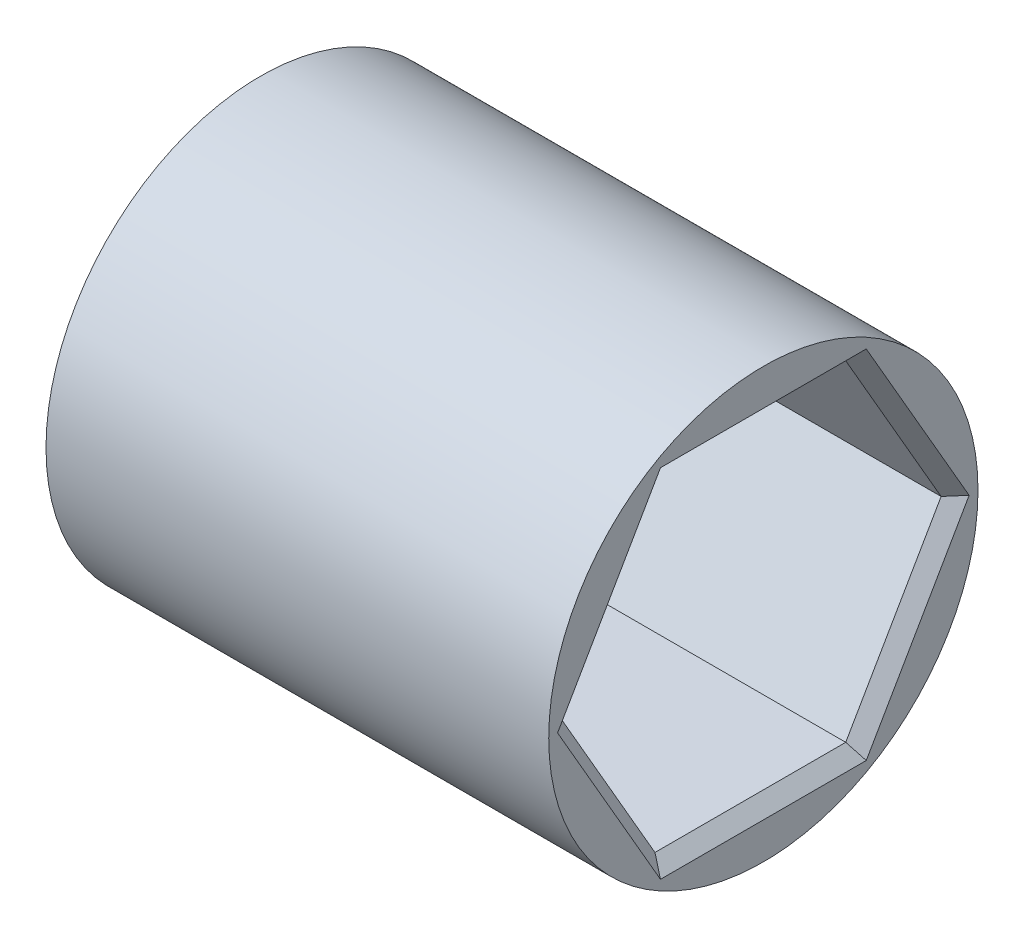
ISO-10303-21;
HEADER;
FILE_DESCRIPTION(('STEP AP214'),'2;1');
FILE_NAME('part.step','',(''),(''),'','','');
FILE_SCHEMA(('AUTOMOTIVE_DESIGN { 1 0 10303 214 1 1 1 1 }'));
ENDSEC;
DATA;
#1=APPLICATION_CONTEXT('core data for automotive mechanical design processes');
#2=APPLICATION_PROTOCOL_DEFINITION('international standard','automotive_design',2000,#1);
#3=PRODUCT_CONTEXT('',#1,'mechanical');
#4=PRODUCT('Part','Part','',(#3));
#5=PRODUCT_RELATED_PRODUCT_CATEGORY('part','',(#4));
#6=PRODUCT_DEFINITION_FORMATION('','',#4);
#7=PRODUCT_DEFINITION_CONTEXT('part definition',#1,'design');
#8=PRODUCT_DEFINITION('design','',#6,#7);
#9=PRODUCT_DEFINITION_SHAPE('','',#8);
#10=(LENGTH_UNIT() NAMED_UNIT(*) SI_UNIT(.MILLI.,.METRE.));
#11=(NAMED_UNIT(*) PLANE_ANGLE_UNIT() SI_UNIT($,.RADIAN.));
#12=(NAMED_UNIT(*) SI_UNIT($,.STERADIAN.) SOLID_ANGLE_UNIT());
#13=UNCERTAINTY_MEASURE_WITH_UNIT(LENGTH_MEASURE(1.E-05),#10,'distance_accuracy_value','');
#14=(GEOMETRIC_REPRESENTATION_CONTEXT(3) GLOBAL_UNCERTAINTY_ASSIGNED_CONTEXT((#13)) GLOBAL_UNIT_ASSIGNED_CONTEXT((#10,
#11,#12)) REPRESENTATION_CONTEXT('',''));
#15=CARTESIAN_POINT('',(0.,0.,0.));
#16=DIRECTION('',(0.,0.,1.));
#17=DIRECTION('',(1.,0.,0.));
#18=AXIS2_PLACEMENT_3D('',#15,#16,#17);
#19=CARTESIAN_POINT('',(-20.17981642,0.,0.));
#20=DIRECTION('',(-1.,0.,0.));
#21=DIRECTION('',(0.,0.,1.));
#22=AXIS2_PLACEMENT_3D('',#19,#20,#21);
#23=CYLINDRICAL_SURFACE('',#22,8.25);
#24=CARTESIAN_POINT('',(0.,0.,0.));
#25=DIRECTION('',(-1.,0.,0.));
#26=DIRECTION('',(0.,0.,1.));
#27=AXIS2_PLACEMENT_3D('',#24,#25,#26);
#28=CIRCLE('',#27,8.25);
#29=CARTESIAN_POINT('',(0.,0.,8.25));
#30=VERTEX_POINT('',#29);
#31=EDGE_CURVE('E182',#30,#30,#28,.T.);
#32=ORIENTED_EDGE('',*,*,#31,.T.);
#33=EDGE_LOOP('',(#32));
#34=FACE_BOUND('',#33,.T.);
#35=CARTESIAN_POINT('',(-19.3231192,0.,0.));
#36=DIRECTION('',(-1.,0.,0.));
#37=DIRECTION('',(0.,0.,1.));
#38=AXIS2_PLACEMENT_3D('',#35,#36,#37);
#39=CIRCLE('',#38,8.25);
#40=CARTESIAN_POINT('',(-19.3231192,0.,8.25));
#41=VERTEX_POINT('',#40);
#42=EDGE_CURVE('E189',#41,#41,#39,.T.);
#43=ORIENTED_EDGE('',*,*,#42,.F.);
#44=EDGE_LOOP('',(#43));
#45=FACE_BOUND('',#44,.T.);
#46=ADVANCED_FACE('F51',(#34,#45),#23,.T.);
#47=CARTESIAN_POINT('',(-19.3231192,0.,0.));
#48=DIRECTION('',(-1.,0.,0.));
#49=DIRECTION('',(0.,0.,1.));
#50=AXIS2_PLACEMENT_3D('',#47,#48,#49);
#51=PLANE('',#50);
#52=DIRECTION('',(0.,0.,-1.));
#53=VECTOR('',#52,1.);
#54=CARTESIAN_POINT('',(-19.3231192,-6.85,-3.66617420935412));
#55=LINE('',#54,#53);
#56=CARTESIAN_POINT('',(-19.3231192,-6.85,3.95484934394893));
#57=VERTEX_POINT('',#56);
#58=CARTESIAN_POINT('',(-19.3231192,-6.85,-3.95484934394894));
#59=VERTEX_POINT('',#58);
#60=EDGE_CURVE('E218',#57,#59,#55,.T.);
#61=ORIENTED_EDGE('',*,*,#60,.T.);
#62=DIRECTION('',(0.,0.866025403784439,-0.5));
#63=VECTOR('',#62,1.);
#64=CARTESIAN_POINT('',(-19.3231192,-0.25,-7.76536112060047));
#65=LINE('',#64,#63);
#66=CARTESIAN_POINT('',(-19.3231192,0.,-7.90969868789787));
#67=VERTEX_POINT('',#66);
#68=EDGE_CURVE('E150',#59,#67,#65,.T.);
#69=ORIENTED_EDGE('',*,*,#68,.T.);
#70=DIRECTION('',(0.,0.866025403784439,0.5));
#71=VECTOR('',#70,1.);
#72=CARTESIAN_POINT('',(-19.3231192,6.6,-4.09918691124634));
#73=LINE('',#72,#71);
#74=CARTESIAN_POINT('',(-19.3231192,6.85,-3.95484934394893));
#75=VERTEX_POINT('',#74);
#76=EDGE_CURVE('E176',#67,#75,#73,.T.);
#77=ORIENTED_EDGE('',*,*,#76,.T.);
#78=DIRECTION('',(0.,0.,1.));
#79=VECTOR('',#78,1.);
#80=CARTESIAN_POINT('',(-19.3231192,6.85,3.66617420935412));
#81=LINE('',#80,#79);
#82=CARTESIAN_POINT('',(-19.3231192,6.85,3.95484934394894));
#83=VERTEX_POINT('',#82);
#84=EDGE_CURVE('E212',#75,#83,#81,.T.);
#85=ORIENTED_EDGE('',*,*,#84,.T.);
#86=DIRECTION('',(0.,-0.866025403784439,0.5));
#87=VECTOR('',#86,1.);
#88=CARTESIAN_POINT('',(-19.3231192,0.25,7.76536112060047));
#89=LINE('',#88,#87);
#90=CARTESIAN_POINT('',(-19.3231192,0.,7.90969868789787));
#91=VERTEX_POINT('',#90);
#92=EDGE_CURVE('E214',#83,#91,#89,.T.);
#93=ORIENTED_EDGE('',*,*,#92,.T.);
#94=DIRECTION('',(0.,-0.866025403784439,-0.5));
#95=VECTOR('',#94,1.);
#96=CARTESIAN_POINT('',(-19.3231192,-6.6,4.09918691124634));
#97=LINE('',#96,#95);
#98=EDGE_CURVE('E216',#91,#57,#97,.T.);
#99=ORIENTED_EDGE('',*,*,#98,.T.);
#100=EDGE_LOOP('',(#61,#69,#77,#85,#93,#99));
#101=FACE_BOUND('',#100,.T.);
#102=ORIENTED_EDGE('',*,*,#42,.T.);
#103=EDGE_LOOP('',(#102));
#104=FACE_BOUND('',#103,.T.);
#105=ADVANCED_FACE('F305',(#101,#104),#51,.T.);
#106=CARTESIAN_POINT('',(0.,0.,0.));
#107=DIRECTION('',(-1.,0.,0.));
#108=DIRECTION('',(0.,0.,1.));
#109=AXIS2_PLACEMENT_3D('',#106,#107,#108);
#110=PLANE('',#109);
#111=DIRECTION('',(0.,0.,-1.));
#112=VECTOR('',#111,1.);
#113=CARTESIAN_POINT('',(0.,6.85,0.));
#114=LINE('',#113,#112);
#115=CARTESIAN_POINT('',(0.,6.85,3.95484934394894));
#116=VERTEX_POINT('',#115);
#117=CARTESIAN_POINT('',(0.,6.85,-3.95484934394893));
#118=VERTEX_POINT('',#117);
#119=EDGE_CURVE('E238',#116,#118,#114,.T.);
#120=ORIENTED_EDGE('',*,*,#119,.T.);
#121=DIRECTION('',(0.,-0.866025403784439,-0.5));
#122=VECTOR('',#121,1.);
#123=CARTESIAN_POINT('',(0.,3.425,-5.9322740159234));
#124=LINE('',#123,#122);
#125=CARTESIAN_POINT('',(0.,0.,-7.90969868789787));
#126=VERTEX_POINT('',#125);
#127=EDGE_CURVE('E11',#118,#126,#124,.T.);
#128=ORIENTED_EDGE('',*,*,#127,.T.);
#129=DIRECTION('',(0.,-0.866025403784439,0.5));
#130=VECTOR('',#129,1.);
#131=CARTESIAN_POINT('',(0.,-3.425,-5.93227401592341));
#132=LINE('',#131,#130);
#133=CARTESIAN_POINT('',(0.,-6.85,-3.95484934394894));
#134=VERTEX_POINT('',#133);
#135=EDGE_CURVE('E61',#126,#134,#132,.T.);
#136=ORIENTED_EDGE('',*,*,#135,.T.);
#137=DIRECTION('',(0.,0.,1.));
#138=VECTOR('',#137,1.);
#139=CARTESIAN_POINT('',(0.,-6.85,0.));
#140=LINE('',#139,#138);
#141=CARTESIAN_POINT('',(0.,-6.85,3.95484934394893));
#142=VERTEX_POINT('',#141);
#143=EDGE_CURVE('E244',#134,#142,#140,.T.);
#144=ORIENTED_EDGE('',*,*,#143,.T.);
#145=DIRECTION('',(0.,0.866025403784439,0.5));
#146=VECTOR('',#145,1.);
#147=CARTESIAN_POINT('',(0.,-3.425,5.9322740159234));
#148=LINE('',#147,#146);
#149=CARTESIAN_POINT('',(0.,0.,7.90969868789787));
#150=VERTEX_POINT('',#149);
#151=EDGE_CURVE('E242',#142,#150,#148,.T.);
#152=ORIENTED_EDGE('',*,*,#151,.T.);
#153=DIRECTION('',(0.,0.866025403784439,-0.5));
#154=VECTOR('',#153,1.);
#155=CARTESIAN_POINT('',(0.,3.425,5.93227401592341));
#156=LINE('',#155,#154);
#157=EDGE_CURVE('E240',#150,#116,#156,.T.);
#158=ORIENTED_EDGE('',*,*,#157,.T.);
#159=EDGE_LOOP('',(#120,#128,#136,#144,#152,#158));
#160=FACE_BOUND('',#159,.T.);
#161=ORIENTED_EDGE('',*,*,#31,.F.);
#162=EDGE_LOOP('',(#161));
#163=FACE_BOUND('',#162,.T.);
#164=ADVANCED_FACE('F278',(#160,#163),#110,.F.);
#165=CARTESIAN_POINT('',(-20.17981642,-6.35,-3.66617420935412));
#166=DIRECTION('',(0.,-0.5,-0.866025403784439));
#167=DIRECTION('',(0.,0.866025403784439,-0.5));
#168=AXIS2_PLACEMENT_3D('',#165,#166,#167);
#169=PLANE('',#168);
#170=DIRECTION('',(1.,0.,0.));
#171=VECTOR('',#170,1.);
#172=CARTESIAN_POINT('',(-20.17981642,0.,-7.33234841870825));
#173=LINE('',#172,#171);
#174=CARTESIAN_POINT('',(-18.8231192,0.,-7.33234841870825));
#175=VERTEX_POINT('',#174);
#176=CARTESIAN_POINT('',(-0.5,0.,-7.33234841870825));
#177=VERTEX_POINT('',#176);
#178=EDGE_CURVE('E174',#175,#177,#173,.T.);
#179=ORIENTED_EDGE('',*,*,#178,.F.);
#180=DIRECTION('',(0.,-0.866025403784439,0.5));
#181=VECTOR('',#180,1.);
#182=CARTESIAN_POINT('',(-18.8231192,-6.35,-3.66617420935412));
#183=LINE('',#182,#181);
#184=CARTESIAN_POINT('',(-18.8231192,-6.35,-3.66617420935412));
#185=VERTEX_POINT('',#184);
#186=EDGE_CURVE('E148',#175,#185,#183,.T.);
#187=ORIENTED_EDGE('',*,*,#186,.T.);
#188=DIRECTION('',(1.,0.,0.));
#189=VECTOR('',#188,1.);
#190=CARTESIAN_POINT('',(-20.17981642,-6.35,-3.66617420935412));
#191=LINE('',#190,#189);
#192=CARTESIAN_POINT('',(-0.5,-6.35,-3.66617420935412));
#193=VERTEX_POINT('',#192);
#194=EDGE_CURVE('E171',#185,#193,#191,.T.);
#195=ORIENTED_EDGE('',*,*,#194,.T.);
#196=DIRECTION('',(0.,0.866025403784439,-0.5));
#197=VECTOR('',#196,1.);
#198=CARTESIAN_POINT('',(-0.5,-6.35,-3.66617420935412));
#199=LINE('',#198,#197);
#200=EDGE_CURVE('E177',#193,#177,#199,.T.);
#201=ORIENTED_EDGE('',*,*,#200,.T.);
#202=EDGE_LOOP('',(#179,#187,#195,#201));
#203=FACE_BOUND('',#202,.T.);
#204=ADVANCED_FACE('F170',(#203),#169,.F.);
#205=CARTESIAN_POINT('',(-20.17981642,-6.35,3.66617420935412));
#206=DIRECTION('',(0.,-1.,0.));
#207=DIRECTION('',(0.,0.,-1.));
#208=AXIS2_PLACEMENT_3D('',#205,#206,#207);
#209=PLANE('',#208);
#210=ORIENTED_EDGE('',*,*,#194,.F.);
#211=DIRECTION('',(0.,0.,1.));
#212=VECTOR('',#211,1.);
#213=CARTESIAN_POINT('',(-18.8231192,-6.35,3.66617420935412));
#214=LINE('',#213,#212);
#215=CARTESIAN_POINT('',(-18.8231192,-6.35,3.66617420935412));
#216=VERTEX_POINT('',#215);
#217=EDGE_CURVE('E156',#185,#216,#214,.T.);
#218=ORIENTED_EDGE('',*,*,#217,.T.);
#219=DIRECTION('',(1.,0.,0.));
#220=VECTOR('',#219,1.);
#221=CARTESIAN_POINT('',(-20.17981642,-6.35,3.66617420935412));
#222=LINE('',#221,#220);
#223=CARTESIAN_POINT('',(-0.5,-6.35,3.66617420935412));
#224=VERTEX_POINT('',#223);
#225=EDGE_CURVE('E183',#216,#224,#222,.T.);
#226=ORIENTED_EDGE('',*,*,#225,.T.);
#227=DIRECTION('',(0.,0.,-1.));
#228=VECTOR('',#227,1.);
#229=CARTESIAN_POINT('',(-0.5,-6.35,3.66617420935412));
#230=LINE('',#229,#228);
#231=EDGE_CURVE('E165',#224,#193,#230,.T.);
#232=ORIENTED_EDGE('',*,*,#231,.T.);
#233=EDGE_LOOP('',(#210,#218,#226,#232));
#234=FACE_BOUND('',#233,.T.);
#235=ADVANCED_FACE('F179',(#234),#209,.F.);
#236=CARTESIAN_POINT('',(-20.17981642,0.,7.33234841870825));
#237=DIRECTION('',(0.,-0.5,0.866025403784439));
#238=DIRECTION('',(0.,-0.866025403784439,-0.5));
#239=AXIS2_PLACEMENT_3D('',#236,#237,#238);
#240=PLANE('',#239);
#241=ORIENTED_EDGE('',*,*,#225,.F.);
#242=DIRECTION('',(0.,0.866025403784439,0.5));
#243=VECTOR('',#242,1.);
#244=CARTESIAN_POINT('',(-18.8231192,0.,7.33234841870825));
#245=LINE('',#244,#243);
#246=CARTESIAN_POINT('',(-18.8231192,0.,7.33234841870825));
#247=VERTEX_POINT('',#246);
#248=EDGE_CURVE('E223',#216,#247,#245,.T.);
#249=ORIENTED_EDGE('',*,*,#248,.T.);
#250=DIRECTION('',(1.,0.,0.));
#251=VECTOR('',#250,1.);
#252=CARTESIAN_POINT('',(-20.17981642,0.,7.33234841870825));
#253=LINE('',#252,#251);
#254=CARTESIAN_POINT('',(-0.5,0.,7.33234841870825));
#255=VERTEX_POINT('',#254);
#256=EDGE_CURVE('E192',#247,#255,#253,.T.);
#257=ORIENTED_EDGE('',*,*,#256,.T.);
#258=DIRECTION('',(0.,-0.866025403784439,-0.5));
#259=VECTOR('',#258,1.);
#260=CARTESIAN_POINT('',(-0.5,0.,7.33234841870825));
#261=LINE('',#260,#259);
#262=EDGE_CURVE('E164',#255,#224,#261,.T.);
#263=ORIENTED_EDGE('',*,*,#262,.T.);
#264=EDGE_LOOP('',(#241,#249,#257,#263));
#265=FACE_BOUND('',#264,.T.);
#266=ADVANCED_FACE('F315',(#265),#240,.F.);
#267=CARTESIAN_POINT('',(-20.17981642,6.35,3.66617420935412));
#268=DIRECTION('',(0.,0.5,0.866025403784439));
#269=DIRECTION('',(0.,-0.866025403784438,0.5));
#270=AXIS2_PLACEMENT_3D('',#267,#268,#269);
#271=PLANE('',#270);
#272=ORIENTED_EDGE('',*,*,#256,.F.);
#273=DIRECTION('',(0.,0.866025403784438,-0.5));
#274=VECTOR('',#273,1.);
#275=CARTESIAN_POINT('',(-18.8231192,6.35,3.66617420935412));
#276=LINE('',#275,#274);
#277=CARTESIAN_POINT('',(-18.8231192,6.35,3.66617420935412));
#278=VERTEX_POINT('',#277);
#279=EDGE_CURVE('E227',#247,#278,#276,.T.);
#280=ORIENTED_EDGE('',*,*,#279,.T.);
#281=DIRECTION('',(1.,0.,0.));
#282=VECTOR('',#281,1.);
#283=CARTESIAN_POINT('',(-20.17981642,6.35,3.66617420935412));
#284=LINE('',#283,#282);
#285=CARTESIAN_POINT('',(-0.5,6.35,3.66617420935412));
#286=VERTEX_POINT('',#285);
#287=EDGE_CURVE('E198',#278,#286,#284,.T.);
#288=ORIENTED_EDGE('',*,*,#287,.T.);
#289=DIRECTION('',(0.,-0.866025403784438,0.5));
#290=VECTOR('',#289,1.);
#291=CARTESIAN_POINT('',(-0.5,6.35,3.66617420935412));
#292=LINE('',#291,#290);
#293=EDGE_CURVE('E225',#286,#255,#292,.T.);
#294=ORIENTED_EDGE('',*,*,#293,.T.);
#295=EDGE_LOOP('',(#272,#280,#288,#294));
#296=FACE_BOUND('',#295,.T.);
#297=ADVANCED_FACE('F318',(#296),#271,.F.);
#298=CARTESIAN_POINT('',(-20.17981642,6.35,-3.66617420935412));
#299=DIRECTION('',(0.,1.,0.));
#300=DIRECTION('',(0.,0.,1.));
#301=AXIS2_PLACEMENT_3D('',#298,#299,#300);
#302=PLANE('',#301);
#303=ORIENTED_EDGE('',*,*,#287,.F.);
#304=DIRECTION('',(0.,0.,-1.));
#305=VECTOR('',#304,1.);
#306=CARTESIAN_POINT('',(-18.8231192,6.35,-3.66617420935412));
#307=LINE('',#306,#305);
#308=CARTESIAN_POINT('',(-18.8231192,6.35,-3.66617420935412));
#309=VERTEX_POINT('',#308);
#310=EDGE_CURVE('E231',#278,#309,#307,.T.);
#311=ORIENTED_EDGE('',*,*,#310,.T.);
#312=DIRECTION('',(1.,0.,0.));
#313=VECTOR('',#312,1.);
#314=CARTESIAN_POINT('',(-20.17981642,6.35,-3.66617420935412));
#315=LINE('',#314,#313);
#316=CARTESIAN_POINT('',(-0.5,6.35,-3.66617420935412));
#317=VERTEX_POINT('',#316);
#318=EDGE_CURVE('E202',#309,#317,#315,.T.);
#319=ORIENTED_EDGE('',*,*,#318,.T.);
#320=DIRECTION('',(0.,0.,1.));
#321=VECTOR('',#320,1.);
#322=CARTESIAN_POINT('',(-0.5,6.35,-3.66617420935412));
#323=LINE('',#322,#321);
#324=EDGE_CURVE('E229',#317,#286,#323,.T.);
#325=ORIENTED_EDGE('',*,*,#324,.T.);
#326=EDGE_LOOP('',(#303,#311,#319,#325));
#327=FACE_BOUND('',#326,.T.);
#328=ADVANCED_FACE('F294',(#327),#302,.F.);
#329=CARTESIAN_POINT('',(-20.17981642,0.,-7.33234841870825));
#330=DIRECTION('',(0.,0.5,-0.866025403784439));
#331=DIRECTION('',(0.,0.866025403784439,0.5));
#332=AXIS2_PLACEMENT_3D('',#329,#330,#331);
#333=PLANE('',#332);
#334=ORIENTED_EDGE('',*,*,#318,.F.);
#335=DIRECTION('',(0.,-0.866025403784439,-0.5));
#336=VECTOR('',#335,1.);
#337=CARTESIAN_POINT('',(-18.8231192,0.,-7.33234841870825));
#338=LINE('',#337,#336);
#339=EDGE_CURVE('E236',#309,#175,#338,.T.);
#340=ORIENTED_EDGE('',*,*,#339,.T.);
#341=ORIENTED_EDGE('',*,*,#178,.T.);
#342=DIRECTION('',(0.,0.866025403784439,0.5));
#343=VECTOR('',#342,1.);
#344=CARTESIAN_POINT('',(-0.5,0.,-7.33234841870825));
#345=LINE('',#344,#343);
#346=EDGE_CURVE('E233',#177,#317,#345,.T.);
#347=ORIENTED_EDGE('',*,*,#346,.T.);
#348=EDGE_LOOP('',(#334,#340,#341,#347));
#349=FACE_BOUND('',#348,.T.);
#350=ADVANCED_FACE('F290',(#349),#333,.F.);
#351=CARTESIAN_POINT('',(-18.8231192,6.35,3.66617420935412));
#352=DIRECTION('',(-0.707106781186551,-0.353553390593272,-0.612372435695791));
#353=DIRECTION('',(0.,-0.866025403784438,0.5));
#354=AXIS2_PLACEMENT_3D('',#351,#352,#353);
#355=PLANE('',#354);
#356=DIRECTION('',(-0.654653670707973,0.,0.755928946018458));
#357=VECTOR('',#356,1.);
#358=CARTESIAN_POINT('',(-18.8231192,0.,7.33234841870825));
#359=LINE('',#358,#357);
#360=EDGE_CURVE('E252',#91,#247,#359,.F.);
#361=ORIENTED_EDGE('',*,*,#360,.F.);
#362=ORIENTED_EDGE('',*,*,#92,.F.);
#363=DIRECTION('',(-0.654653670707973,0.65465367070798,0.377964473009229));
#364=VECTOR('',#363,1.);
#365=CARTESIAN_POINT('',(-18.8231192,6.35,3.66617420935412));
#366=LINE('',#365,#364);
#367=EDGE_CURVE('E206',#278,#83,#366,.T.);
#368=ORIENTED_EDGE('',*,*,#367,.F.);
#369=ORIENTED_EDGE('',*,*,#279,.F.);
#370=EDGE_LOOP('',(#361,#362,#368,#369));
#371=FACE_BOUND('',#370,.T.);
#372=ADVANCED_FACE('F320',(#371),#355,.T.);
#373=CARTESIAN_POINT('',(-18.8231192,6.35,-3.66617420935412));
#374=DIRECTION('',(-0.707106781186551,-0.707106781186544,0.));
#375=DIRECTION('',(0.,0.,1.));
#376=AXIS2_PLACEMENT_3D('',#373,#374,#375);
#377=PLANE('',#376);
#378=ORIENTED_EDGE('',*,*,#367,.T.);
#379=ORIENTED_EDGE('',*,*,#84,.F.);
#380=DIRECTION('',(-0.654653670707974,0.65465367070798,-0.377964473009228));
#381=VECTOR('',#380,1.);
#382=CARTESIAN_POINT('',(-18.8231192,6.35,-3.66617420935412));
#383=LINE('',#382,#381);
#384=EDGE_CURVE('E249',#309,#75,#383,.T.);
#385=ORIENTED_EDGE('',*,*,#384,.F.);
#386=ORIENTED_EDGE('',*,*,#310,.F.);
#387=EDGE_LOOP('',(#378,#379,#385,#386));
#388=FACE_BOUND('',#387,.T.);
#389=ADVANCED_FACE('F298',(#388),#377,.T.);
#390=CARTESIAN_POINT('',(-18.8231192,0.,7.33234841870825));
#391=DIRECTION('',(-0.707106781186551,0.353553390593272,-0.612372435695791));
#392=DIRECTION('',(0.,-0.866025403784439,-0.5));
#393=AXIS2_PLACEMENT_3D('',#390,#391,#392);
#394=PLANE('',#393);
#395=ORIENTED_EDGE('',*,*,#360,.T.);
#396=ORIENTED_EDGE('',*,*,#248,.F.);
#397=DIRECTION('',(-0.654653670707973,-0.654653670707981,0.377964473009228));
#398=VECTOR('',#397,1.);
#399=CARTESIAN_POINT('',(-18.8231192,-6.35,3.66617420935412));
#400=LINE('',#399,#398);
#401=EDGE_CURVE('E159',#57,#216,#400,.F.);
#402=ORIENTED_EDGE('',*,*,#401,.F.);
#403=ORIENTED_EDGE('',*,*,#98,.F.);
#404=EDGE_LOOP('',(#395,#396,#402,#403));
#405=FACE_BOUND('',#404,.T.);
#406=ADVANCED_FACE('F312',(#405),#394,.T.);
#407=CARTESIAN_POINT('',(-18.8231192,0.,-7.33234841870825));
#408=DIRECTION('',(-0.707106781186551,-0.353553390593272,0.612372435695792));
#409=DIRECTION('',(0.,0.866025403784439,0.5));
#410=AXIS2_PLACEMENT_3D('',#407,#408,#409);
#411=PLANE('',#410);
#412=ORIENTED_EDGE('',*,*,#384,.T.);
#413=ORIENTED_EDGE('',*,*,#76,.F.);
#414=DIRECTION('',(0.654653670707974,0.,0.755928946018458));
#415=VECTOR('',#414,1.);
#416=CARTESIAN_POINT('',(-17.0088334857143,0.,-5.23739172764873));
#417=LINE('',#416,#415);
#418=EDGE_CURVE('E153',#175,#67,#417,.F.);
#419=ORIENTED_EDGE('',*,*,#418,.F.);
#420=ORIENTED_EDGE('',*,*,#339,.F.);
#421=EDGE_LOOP('',(#412,#413,#419,#420));
#422=FACE_BOUND('',#421,.T.);
#423=ADVANCED_FACE('F303',(#422),#411,.T.);
#424=CARTESIAN_POINT('',(-18.8231192,-6.35,3.66617420935412));
#425=DIRECTION('',(-0.707106781186552,0.707106781186544,0.));
#426=DIRECTION('',(0.,0.,-1.));
#427=AXIS2_PLACEMENT_3D('',#424,#425,#426);
#428=PLANE('',#427);
#429=ORIENTED_EDGE('',*,*,#401,.T.);
#430=ORIENTED_EDGE('',*,*,#217,.F.);
#431=DIRECTION('',(-0.654653670707973,-0.65465367070798,-0.377964473009228));
#432=VECTOR('',#431,1.);
#433=CARTESIAN_POINT('',(-18.8231192,-6.35,-3.66617420935412));
#434=LINE('',#433,#432);
#435=EDGE_CURVE('E144',#59,#185,#434,.F.);
#436=ORIENTED_EDGE('',*,*,#435,.F.);
#437=ORIENTED_EDGE('',*,*,#60,.F.);
#438=EDGE_LOOP('',(#429,#430,#436,#437));
#439=FACE_BOUND('',#438,.T.);
#440=ADVANCED_FACE('F157',(#439),#428,.T.);
#441=CARTESIAN_POINT('',(-18.8231192,-6.35,-3.66617420935412));
#442=DIRECTION('',(-0.707106781186551,0.353553390593272,0.612372435695791));
#443=DIRECTION('',(0.,0.866025403784439,-0.5));
#444=AXIS2_PLACEMENT_3D('',#441,#442,#443);
#445=PLANE('',#444);
#446=ORIENTED_EDGE('',*,*,#418,.T.);
#447=ORIENTED_EDGE('',*,*,#68,.F.);
#448=ORIENTED_EDGE('',*,*,#435,.T.);
#449=ORIENTED_EDGE('',*,*,#186,.F.);
#450=EDGE_LOOP('',(#446,#447,#448,#449));
#451=FACE_BOUND('',#450,.T.);
#452=ADVANCED_FACE('F146',(#451),#445,.T.);
#453=CARTESIAN_POINT('',(-0.5,0.,7.33234841870825));
#454=DIRECTION('',(-0.707106781186547,-0.353553390593274,0.612372435695795));
#455=DIRECTION('',(0.,-0.866025403784439,-0.5));
#456=AXIS2_PLACEMENT_3D('',#453,#454,#455);
#457=PLANE('',#456);
#458=DIRECTION('',(-0.654653670707977,0.,-0.755928946018454));
#459=VECTOR('',#458,1.);
#460=CARTESIAN_POINT('',(-0.5,0.,7.33234841870825));
#461=LINE('',#460,#459);
#462=EDGE_CURVE('E265',#150,#255,#461,.T.);
#463=ORIENTED_EDGE('',*,*,#462,.F.);
#464=ORIENTED_EDGE('',*,*,#151,.F.);
#465=DIRECTION('',(-0.654653670707977,0.654653670707978,-0.377964473009226));
#466=VECTOR('',#465,1.);
#467=CARTESIAN_POINT('',(-0.5,-6.35,3.66617420935412));
#468=LINE('',#467,#466);
#469=EDGE_CURVE('E56',#224,#142,#468,.F.);
#470=ORIENTED_EDGE('',*,*,#469,.F.);
#471=ORIENTED_EDGE('',*,*,#262,.F.);
#472=EDGE_LOOP('',(#463,#464,#470,#471));
#473=FACE_BOUND('',#472,.T.);
#474=ADVANCED_FACE('F54',(#473),#457,.F.);
#475=CARTESIAN_POINT('',(-0.5,-6.35,3.66617420935412));
#476=DIRECTION('',(-0.707106781186548,-0.707106781186547,0.));
#477=DIRECTION('',(0.,0.,-1.));
#478=AXIS2_PLACEMENT_3D('',#475,#476,#477);
#479=PLANE('',#478);
#480=ORIENTED_EDGE('',*,*,#469,.T.);
#481=ORIENTED_EDGE('',*,*,#143,.F.);
#482=DIRECTION('',(-0.654653670707977,0.654653670707977,0.377964473009228));
#483=VECTOR('',#482,1.);
#484=CARTESIAN_POINT('',(-0.5,-6.35,-3.66617420935412));
#485=LINE('',#484,#483);
#486=EDGE_CURVE('E263',#193,#134,#485,.F.);
#487=ORIENTED_EDGE('',*,*,#486,.F.);
#488=ORIENTED_EDGE('',*,*,#231,.F.);
#489=EDGE_LOOP('',(#480,#481,#487,#488));
#490=FACE_BOUND('',#489,.T.);
#491=ADVANCED_FACE('F274',(#490),#479,.F.);
#492=CARTESIAN_POINT('',(-0.5,6.35,3.66617420935412));
#493=DIRECTION('',(-0.707106781186548,0.353553390593274,0.612372435695794));
#494=DIRECTION('',(0.,-0.866025403784438,0.5));
#495=AXIS2_PLACEMENT_3D('',#492,#493,#494);
#496=PLANE('',#495);
#497=ORIENTED_EDGE('',*,*,#462,.T.);
#498=ORIENTED_EDGE('',*,*,#293,.F.);
#499=DIRECTION('',(-0.654653670707977,-0.654653670707977,-0.377964473009227));
#500=VECTOR('',#499,1.);
#501=CARTESIAN_POINT('',(-0.5,6.35,3.66617420935412));
#502=LINE('',#501,#500);
#503=EDGE_CURVE('E260',#116,#286,#502,.T.);
#504=ORIENTED_EDGE('',*,*,#503,.F.);
#505=ORIENTED_EDGE('',*,*,#157,.F.);
#506=EDGE_LOOP('',(#497,#498,#504,#505));
#507=FACE_BOUND('',#506,.T.);
#508=ADVANCED_FACE('F282',(#507),#496,.F.);
#509=CARTESIAN_POINT('',(-0.5,-6.35,-3.66617420935412));
#510=DIRECTION('',(-0.707106781186548,-0.353553390593273,-0.612372435695794));
#511=DIRECTION('',(0.,0.866025403784439,-0.5));
#512=AXIS2_PLACEMENT_3D('',#509,#510,#511);
#513=PLANE('',#512);
#514=ORIENTED_EDGE('',*,*,#486,.T.);
#515=ORIENTED_EDGE('',*,*,#135,.F.);
#516=DIRECTION('',(-0.654653670707977,0.,0.755928946018455));
#517=VECTOR('',#516,1.);
#518=CARTESIAN_POINT('',(-0.5,0.,-7.33234841870825));
#519=LINE('',#518,#517);
#520=EDGE_CURVE('E69',#177,#126,#519,.F.);
#521=ORIENTED_EDGE('',*,*,#520,.F.);
#522=ORIENTED_EDGE('',*,*,#200,.F.);
#523=EDGE_LOOP('',(#514,#515,#521,#522));
#524=FACE_BOUND('',#523,.T.);
#525=ADVANCED_FACE('F408',(#524),#513,.F.);
#526=CARTESIAN_POINT('',(-0.5,6.35,-3.66617420935412));
#527=DIRECTION('',(-0.707106781186547,0.707106781186547,0.));
#528=DIRECTION('',(0.,0.,1.));
#529=AXIS2_PLACEMENT_3D('',#526,#527,#528);
#530=PLANE('',#529);
#531=ORIENTED_EDGE('',*,*,#503,.T.);
#532=ORIENTED_EDGE('',*,*,#324,.F.);
#533=DIRECTION('',(0.654653670707977,0.654653670707977,-0.377964473009227));
#534=VECTOR('',#533,1.);
#535=CARTESIAN_POINT('',(-2.31428571428572,4.53571428571428,-2.61869586382437));
#536=LINE('',#535,#534);
#537=EDGE_CURVE('E257',#118,#317,#536,.F.);
#538=ORIENTED_EDGE('',*,*,#537,.F.);
#539=ORIENTED_EDGE('',*,*,#119,.F.);
#540=EDGE_LOOP('',(#531,#532,#538,#539));
#541=FACE_BOUND('',#540,.T.);
#542=ADVANCED_FACE('F286',(#541),#530,.F.);
#543=CARTESIAN_POINT('',(-0.5,0.,-7.33234841870825));
#544=DIRECTION('',(-0.707106781186547,0.353553390593274,-0.612372435695795));
#545=DIRECTION('',(0.,0.866025403784439,0.5));
#546=AXIS2_PLACEMENT_3D('',#543,#544,#545);
#547=PLANE('',#546);
#548=ORIENTED_EDGE('',*,*,#520,.T.);
#549=ORIENTED_EDGE('',*,*,#127,.F.);
#550=ORIENTED_EDGE('',*,*,#537,.T.);
#551=ORIENTED_EDGE('',*,*,#346,.F.);
#552=EDGE_LOOP('',(#548,#549,#550,#551));
#553=FACE_BOUND('',#552,.T.);
#554=ADVANCED_FACE('F287',(#553),#547,.F.);
#555=CLOSED_SHELL('',(#46,#105,#164,#204,#235,#266,#297,#328,#350,#372,#389,#406,#423,#440,#452,
#474,#491,#508,#525,#542,#554));
#556=MANIFOLD_SOLID_BREP('B2',#555);
#557=ADVANCED_BREP_SHAPE_REPRESENTATION('',(#18,#556),#14);
#558=SHAPE_DEFINITION_REPRESENTATION(#9,#557);
ENDSEC;
END-ISO-10303-21;
